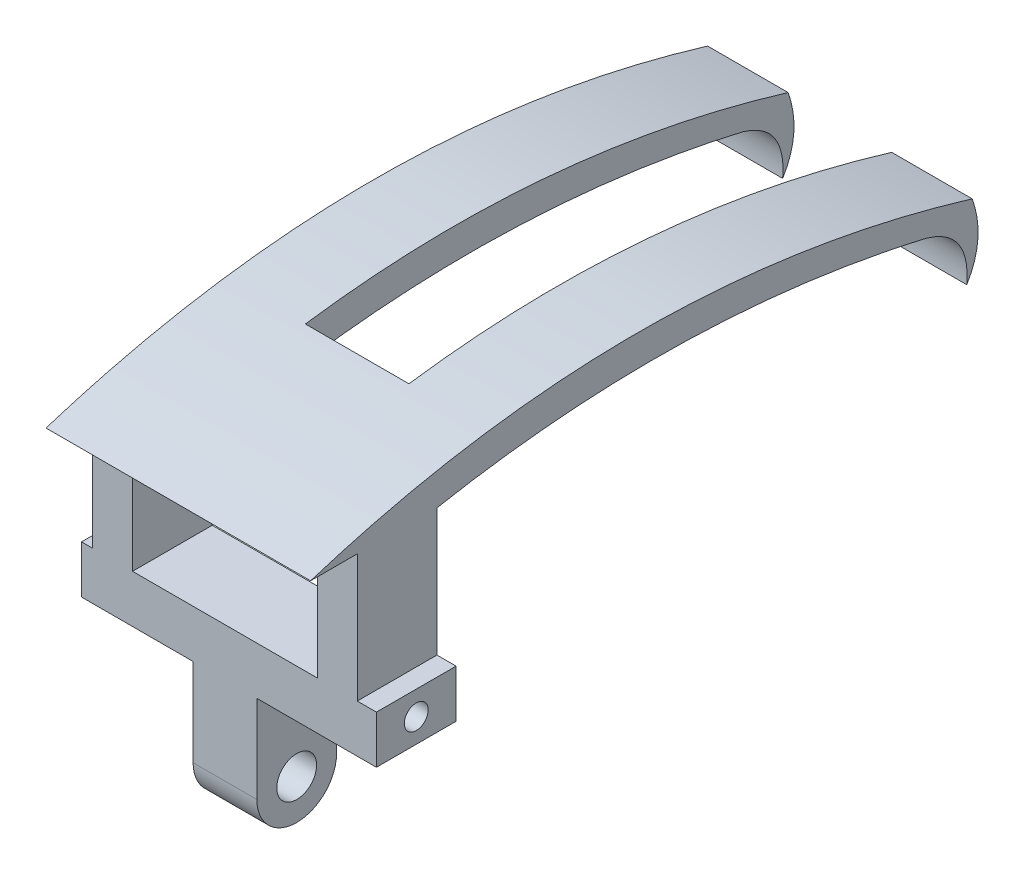
ISO-10303-21;
HEADER;
FILE_DESCRIPTION(('STEP AP214'),'2;1');
FILE_NAME('part.step','',(''),(''),'','','');
FILE_SCHEMA(('AUTOMOTIVE_DESIGN { 1 0 10303 214 1 1 1 1 }'));
ENDSEC;
DATA;
#1=APPLICATION_CONTEXT('core data for automotive mechanical design processes');
#2=APPLICATION_PROTOCOL_DEFINITION('international standard','automotive_design',2000,#1);
#3=PRODUCT_CONTEXT('',#1,'mechanical');
#4=PRODUCT('Part','Part','',(#3));
#5=PRODUCT_RELATED_PRODUCT_CATEGORY('part','',(#4));
#6=PRODUCT_DEFINITION_FORMATION('','',#4);
#7=PRODUCT_DEFINITION_CONTEXT('part definition',#1,'design');
#8=PRODUCT_DEFINITION('design','',#6,#7);
#9=PRODUCT_DEFINITION_SHAPE('','',#8);
#10=(LENGTH_UNIT() NAMED_UNIT(*) SI_UNIT(.MILLI.,.METRE.));
#11=(NAMED_UNIT(*) PLANE_ANGLE_UNIT() SI_UNIT($,.RADIAN.));
#12=(NAMED_UNIT(*) SI_UNIT($,.STERADIAN.) SOLID_ANGLE_UNIT());
#13=UNCERTAINTY_MEASURE_WITH_UNIT(LENGTH_MEASURE(1.E-05),#10,'distance_accuracy_value','');
#14=(GEOMETRIC_REPRESENTATION_CONTEXT(3) GLOBAL_UNCERTAINTY_ASSIGNED_CONTEXT((#13)) GLOBAL_UNIT_ASSIGNED_CONTEXT((#10,
#11,#12)) REPRESENTATION_CONTEXT('',''));
#15=CARTESIAN_POINT('',(0.,0.,0.));
#16=DIRECTION('',(0.,0.,1.));
#17=DIRECTION('',(1.,0.,0.));
#18=AXIS2_PLACEMENT_3D('',#15,#16,#17);
#19=CARTESIAN_POINT('',(0.,30.,0.));
#20=DIRECTION('',(0.,-1.,0.));
#21=DIRECTION('',(0.,0.,-1.));
#22=AXIS2_PLACEMENT_3D('',#19,#20,#21);
#23=PLANE('',#22);
#24=DIRECTION('',(0.,0.,1.));
#25=VECTOR('',#24,1.);
#26=CARTESIAN_POINT('',(185.,30.,0.));
#27=LINE('',#26,#25);
#28=CARTESIAN_POINT('',(185.,30.,0.));
#29=VERTEX_POINT('',#28);
#30=CARTESIAN_POINT('',(185.,30.,50.));
#31=VERTEX_POINT('',#30);
#32=EDGE_CURVE('E212',#29,#31,#27,.T.);
#33=ORIENTED_EDGE('',*,*,#32,.F.);
#34=DIRECTION('',(1.,0.,0.));
#35=VECTOR('',#34,1.);
#36=CARTESIAN_POINT('',(0.,30.,0.));
#37=LINE('',#36,#35);
#38=CARTESIAN_POINT('',(173.,30.,0.));
#39=VERTEX_POINT('',#38);
#40=EDGE_CURVE('E244',#39,#29,#37,.T.);
#41=ORIENTED_EDGE('',*,*,#40,.F.);
#42=DIRECTION('',(0.,0.,-1.));
#43=VECTOR('',#42,1.);
#44=CARTESIAN_POINT('',(173.,30.,50.));
#45=LINE('',#44,#43);
#46=CARTESIAN_POINT('',(173.,30.,50.));
#47=VERTEX_POINT('',#46);
#48=EDGE_CURVE('E233',#47,#39,#45,.T.);
#49=ORIENTED_EDGE('',*,*,#48,.F.);
#50=DIRECTION('',(1.,0.,0.));
#51=VECTOR('',#50,1.);
#52=CARTESIAN_POINT('',(0.,30.,50.));
#53=LINE('',#52,#51);
#54=EDGE_CURVE('E228',#47,#31,#53,.T.);
#55=ORIENTED_EDGE('',*,*,#54,.T.);
#56=EDGE_LOOP('',(#33,#41,#49,#55));
#57=FACE_BOUND('',#56,.T.);
#58=ADVANCED_FACE('F39',(#57),#23,.F.);
#59=CARTESIAN_POINT('',(0.,0.,0.));
#60=DIRECTION('',(0.,-1.,0.));
#61=DIRECTION('',(0.,0.,-1.));
#62=AXIS2_PLACEMENT_3D('',#59,#60,#61);
#63=PLANE('',#62);
#64=DIRECTION('',(1.,0.,0.));
#65=VECTOR('',#64,1.);
#66=CARTESIAN_POINT('',(0.,0.,0.));
#67=LINE('',#66,#65);
#68=CARTESIAN_POINT('',(110.,0.,0.));
#69=VERTEX_POINT('',#68);
#70=CARTESIAN_POINT('',(185.,0.,0.));
#71=VERTEX_POINT('',#70);
#72=EDGE_CURVE('E268',#69,#71,#67,.T.);
#73=ORIENTED_EDGE('',*,*,#72,.T.);
#74=DIRECTION('',(0.,0.,-1.));
#75=VECTOR('',#74,1.);
#76=CARTESIAN_POINT('',(185.,0.,50.));
#77=LINE('',#76,#75);
#78=CARTESIAN_POINT('',(185.,0.,50.));
#79=VERTEX_POINT('',#78);
#80=EDGE_CURVE('E56',#79,#71,#77,.T.);
#81=ORIENTED_EDGE('',*,*,#80,.F.);
#82=DIRECTION('',(1.,0.,0.));
#83=VECTOR('',#82,1.);
#84=CARTESIAN_POINT('',(0.,0.,50.));
#85=LINE('',#84,#83);
#86=CARTESIAN_POINT('',(110.,0.,50.));
#87=VERTEX_POINT('',#86);
#88=EDGE_CURVE('E230',#87,#79,#85,.T.);
#89=ORIENTED_EDGE('',*,*,#88,.F.);
#90=DIRECTION('',(0.,0.,1.));
#91=VECTOR('',#90,1.);
#92=CARTESIAN_POINT('',(110.,0.,0.));
#93=LINE('',#92,#91);
#94=EDGE_CURVE('E289',#69,#87,#93,.T.);
#95=ORIENTED_EDGE('',*,*,#94,.F.);
#96=EDGE_LOOP('',(#73,#81,#89,#95));
#97=FACE_BOUND('',#96,.T.);
#98=ADVANCED_FACE('F561',(#97),#63,.T.);
#99=CARTESIAN_POINT('',(0.,30.,50.));
#100=DIRECTION('',(0.,0.,-1.));
#101=DIRECTION('',(-1.,0.,0.));
#102=AXIS2_PLACEMENT_3D('',#99,#100,#101);
#103=PLANE('',#102);
#104=DIRECTION('',(0.,-1.,0.));
#105=VECTOR('',#104,1.);
#106=CARTESIAN_POINT('',(185.,30.,50.));
#107=LINE('',#106,#105);
#108=EDGE_CURVE('E215',#31,#79,#107,.T.);
#109=ORIENTED_EDGE('',*,*,#108,.F.);
#110=ORIENTED_EDGE('',*,*,#54,.F.);
#111=DIRECTION('',(0.,-1.,0.));
#112=VECTOR('',#111,1.);
#113=CARTESIAN_POINT('',(173.,110.,50.));
#114=LINE('',#113,#112);
#115=CARTESIAN_POINT('',(173.,110.,50.));
#116=VERTEX_POINT('',#115);
#117=EDGE_CURVE('E504',#116,#47,#114,.T.);
#118=ORIENTED_EDGE('',*,*,#117,.F.);
#119=DIRECTION('',(1.,0.,0.));
#120=VECTOR('',#119,1.);
#121=CARTESIAN_POINT('',(148.,110.,50.));
#122=LINE('',#121,#120);
#123=CARTESIAN_POINT('',(148.,110.,50.));
#124=VERTEX_POINT('',#123);
#125=EDGE_CURVE('E517',#124,#116,#122,.T.);
#126=ORIENTED_EDGE('',*,*,#125,.F.);
#127=DIRECTION('',(0.,-1.,0.));
#128=VECTOR('',#127,1.);
#129=CARTESIAN_POINT('',(148.,110.,50.));
#130=LINE('',#129,#128);
#131=CARTESIAN_POINT('',(148.,30.,50.));
#132=VERTEX_POINT('',#131);
#133=EDGE_CURVE('E506',#124,#132,#130,.T.);
#134=ORIENTED_EDGE('',*,*,#133,.T.);
#135=CARTESIAN_POINT('',(32.,30.,50.));
#136=VERTEX_POINT('',#135);
#137=EDGE_CURVE('E234',#136,#132,#53,.T.);
#138=ORIENTED_EDGE('',*,*,#137,.F.);
#139=DIRECTION('',(0.,-1.,0.));
#140=VECTOR('',#139,1.);
#141=CARTESIAN_POINT('',(32.,110.,50.));
#142=LINE('',#141,#140);
#143=CARTESIAN_POINT('',(32.,110.,50.));
#144=VERTEX_POINT('',#143);
#145=EDGE_CURVE('E538',#144,#136,#142,.T.);
#146=ORIENTED_EDGE('',*,*,#145,.F.);
#147=DIRECTION('',(1.,0.,0.));
#148=VECTOR('',#147,1.);
#149=CARTESIAN_POINT('',(7.00000000000001,110.,50.));
#150=LINE('',#149,#148);
#151=CARTESIAN_POINT('',(7.00000000000001,110.,50.));
#152=VERTEX_POINT('',#151);
#153=EDGE_CURVE('E528',#152,#144,#150,.T.);
#154=ORIENTED_EDGE('',*,*,#153,.F.);
#155=DIRECTION('',(0.,-1.,0.));
#156=VECTOR('',#155,1.);
#157=CARTESIAN_POINT('',(7.00000000000001,110.,50.));
#158=LINE('',#157,#156);
#159=CARTESIAN_POINT('',(7.00000000000001,30.,50.));
#160=VERTEX_POINT('',#159);
#161=EDGE_CURVE('E536',#152,#160,#158,.T.);
#162=ORIENTED_EDGE('',*,*,#161,.T.);
#163=CARTESIAN_POINT('',(0.,30.,50.));
#164=VERTEX_POINT('',#163);
#165=EDGE_CURVE('E237',#164,#160,#53,.T.);
#166=ORIENTED_EDGE('',*,*,#165,.F.);
#167=DIRECTION('',(0.,-1.,0.));
#168=VECTOR('',#167,1.);
#169=CARTESIAN_POINT('',(0.,30.,50.));
#170=LINE('',#169,#168);
#171=CARTESIAN_POINT('',(0.,0.,50.));
#172=VERTEX_POINT('',#171);
#173=EDGE_CURVE('E258',#164,#172,#170,.T.);
#174=ORIENTED_EDGE('',*,*,#173,.T.);
#175=CARTESIAN_POINT('',(70.,0.,50.));
#176=VERTEX_POINT('',#175);
#177=EDGE_CURVE('E265',#172,#176,#85,.T.);
#178=ORIENTED_EDGE('',*,*,#177,.T.);
#179=DIRECTION('',(0.,1.,0.));
#180=VECTOR('',#179,1.);
#181=CARTESIAN_POINT('',(70.,-80.,50.));
#182=LINE('',#181,#180);
#183=CARTESIAN_POINT('',(70.,-55.,50.));
#184=VERTEX_POINT('',#183);
#185=EDGE_CURVE('E552',#184,#176,#182,.T.);
#186=ORIENTED_EDGE('',*,*,#185,.F.);
#187=DIRECTION('',(-1.,0.,0.));
#188=VECTOR('',#187,1.);
#189=CARTESIAN_POINT('',(0.,-55.,50.));
#190=LINE('',#189,#188);
#191=CARTESIAN_POINT('',(110.,-55.,50.));
#192=VERTEX_POINT('',#191);
#193=EDGE_CURVE('E276',#184,#192,#190,.F.);
#194=ORIENTED_EDGE('',*,*,#193,.T.);
#195=DIRECTION('',(0.,1.,0.));
#196=VECTOR('',#195,1.);
#197=CARTESIAN_POINT('',(110.,-80.,50.));
#198=LINE('',#197,#196);
#199=EDGE_CURVE('E553',#192,#87,#198,.T.);
#200=ORIENTED_EDGE('',*,*,#199,.T.);
#201=ORIENTED_EDGE('',*,*,#88,.T.);
#202=EDGE_LOOP('',(#109,#110,#118,#126,#134,#138,#146,#154,#162,#166,#174,#178,#186,#194,#200,#201));
#203=FACE_BOUND('',#202,.T.);
#204=ADVANCED_FACE('F226',(#203),#103,.F.);
#205=CARTESIAN_POINT('',(0.,30.,0.));
#206=DIRECTION('',(0.,0.,-1.));
#207=DIRECTION('',(-1.,0.,0.));
#208=AXIS2_PLACEMENT_3D('',#205,#206,#207);
#209=PLANE('',#208);
#210=ORIENTED_EDGE('',*,*,#40,.T.);
#211=DIRECTION('',(0.,1.,0.));
#212=VECTOR('',#211,1.);
#213=CARTESIAN_POINT('',(185.,0.,0.));
#214=LINE('',#213,#212);
#215=EDGE_CURVE('E216',#71,#29,#214,.T.);
#216=ORIENTED_EDGE('',*,*,#215,.F.);
#217=ORIENTED_EDGE('',*,*,#72,.F.);
#218=DIRECTION('',(0.,1.,0.));
#219=VECTOR('',#218,1.);
#220=CARTESIAN_POINT('',(110.,-80.,0.));
#221=LINE('',#220,#219);
#222=CARTESIAN_POINT('',(110.,-55.,0.));
#223=VERTEX_POINT('',#222);
#224=EDGE_CURVE('E548',#223,#69,#221,.T.);
#225=ORIENTED_EDGE('',*,*,#224,.F.);
#226=DIRECTION('',(1.,0.,0.));
#227=VECTOR('',#226,1.);
#228=CARTESIAN_POINT('',(70.,-55.,0.));
#229=LINE('',#228,#227);
#230=CARTESIAN_POINT('',(70.,-55.,0.));
#231=VERTEX_POINT('',#230);
#232=EDGE_CURVE('E283',#223,#231,#229,.F.);
#233=ORIENTED_EDGE('',*,*,#232,.T.);
#234=DIRECTION('',(0.,1.,0.));
#235=VECTOR('',#234,1.);
#236=CARTESIAN_POINT('',(70.,-80.,0.));
#237=LINE('',#236,#235);
#238=CARTESIAN_POINT('',(70.,0.,0.));
#239=VERTEX_POINT('',#238);
#240=EDGE_CURVE('E550',#231,#239,#237,.T.);
#241=ORIENTED_EDGE('',*,*,#240,.T.);
#242=CARTESIAN_POINT('',(0.,0.,0.));
#243=VERTEX_POINT('',#242);
#244=EDGE_CURVE('E239',#243,#239,#67,.T.);
#245=ORIENTED_EDGE('',*,*,#244,.F.);
#246=DIRECTION('',(0.,-1.,0.));
#247=VECTOR('',#246,1.);
#248=CARTESIAN_POINT('',(0.,30.,0.));
#249=LINE('',#248,#247);
#250=CARTESIAN_POINT('',(0.,30.,0.));
#251=VERTEX_POINT('',#250);
#252=EDGE_CURVE('E262',#251,#243,#249,.T.);
#253=ORIENTED_EDGE('',*,*,#252,.F.);
#254=CARTESIAN_POINT('',(7.00000000000001,30.,0.));
#255=VERTEX_POINT('',#254);
#256=EDGE_CURVE('E249',#251,#255,#37,.T.);
#257=ORIENTED_EDGE('',*,*,#256,.T.);
#258=DIRECTION('',(0.,-1.,0.));
#259=VECTOR('',#258,1.);
#260=CARTESIAN_POINT('',(7.00000000000001,110.,0.));
#261=LINE('',#260,#259);
#262=CARTESIAN_POINT('',(7.00000000000001,110.,0.));
#263=VERTEX_POINT('',#262);
#264=EDGE_CURVE('E534',#263,#255,#261,.T.);
#265=ORIENTED_EDGE('',*,*,#264,.F.);
#266=DIRECTION('',(1.,0.,0.));
#267=VECTOR('',#266,1.);
#268=CARTESIAN_POINT('',(7.00000000000001,110.,0.));
#269=LINE('',#268,#267);
#270=CARTESIAN_POINT('',(32.,110.,0.));
#271=VERTEX_POINT('',#270);
#272=EDGE_CURVE('E521',#263,#271,#269,.T.);
#273=ORIENTED_EDGE('',*,*,#272,.T.);
#274=DIRECTION('',(0.,-1.,0.));
#275=VECTOR('',#274,1.);
#276=CARTESIAN_POINT('',(32.,110.,0.));
#277=LINE('',#276,#275);
#278=CARTESIAN_POINT('',(32.,30.,0.));
#279=VERTEX_POINT('',#278);
#280=EDGE_CURVE('E530',#271,#279,#277,.T.);
#281=ORIENTED_EDGE('',*,*,#280,.T.);
#282=CARTESIAN_POINT('',(148.,30.,0.));
#283=VERTEX_POINT('',#282);
#284=EDGE_CURVE('E248',#279,#283,#37,.T.);
#285=ORIENTED_EDGE('',*,*,#284,.T.);
#286=DIRECTION('',(0.,-1.,0.));
#287=VECTOR('',#286,1.);
#288=CARTESIAN_POINT('',(148.,110.,0.));
#289=LINE('',#288,#287);
#290=CARTESIAN_POINT('',(148.,110.,0.));
#291=VERTEX_POINT('',#290);
#292=EDGE_CURVE('E452',#291,#283,#289,.T.);
#293=ORIENTED_EDGE('',*,*,#292,.F.);
#294=DIRECTION('',(1.,0.,0.));
#295=VECTOR('',#294,1.);
#296=CARTESIAN_POINT('',(148.,110.,0.));
#297=LINE('',#296,#295);
#298=CARTESIAN_POINT('',(173.,110.,0.));
#299=VERTEX_POINT('',#298);
#300=EDGE_CURVE('E512',#291,#299,#297,.T.);
#301=ORIENTED_EDGE('',*,*,#300,.T.);
#302=DIRECTION('',(0.,-1.,0.));
#303=VECTOR('',#302,1.);
#304=CARTESIAN_POINT('',(173.,110.,0.));
#305=LINE('',#304,#303);
#306=EDGE_CURVE('E498',#299,#39,#305,.T.);
#307=ORIENTED_EDGE('',*,*,#306,.T.);
#308=EDGE_LOOP('',(#210,#216,#217,#225,#233,#241,#245,#253,#257,#265,#273,#281,#285,#293,#301,#307));
#309=FACE_BOUND('',#308,.T.);
#310=ADVANCED_FACE('F567',(#309),#209,.T.);
#311=CARTESIAN_POINT('',(-419.562765319842,102.884741789651,-307.328252939445));
#312=CARTESIAN_POINT('',(-419.562765319842,94.7930743984296,-334.882025134143));
#313=CARTESIAN_POINT('',(-419.562765319842,65.0245746761726,-332.386652105914));
#314=B_SPLINE_CURVE_WITH_KNOTS('',2,(#311,#312,#313),.UNSPECIFIED.,.F.,.F.,(3,3),(0.,1.),.UNSPECIFIED.);
#315=DIRECTION('',(1.,0.,0.));
#316=VECTOR('',#315,1.);
#317=SURFACE_OF_LINEAR_EXTRUSION('',#314,#316);
#318=DIRECTION('',(1.,0.,0.));
#319=VECTOR('',#318,1.);
#320=CARTESIAN_POINT('',(-419.562765319842,65.0245746761726,-332.386652105914));
#321=LINE('',#320,#319);
#322=CARTESIAN_POINT('',(6.99999999999978,65.0245746761726,-332.386652105914));
#323=VERTEX_POINT('',#322);
#324=CARTESIAN_POINT('',(57.4999999999998,65.0245746761726,-332.386652105914));
#325=VERTEX_POINT('',#324);
#326=EDGE_CURVE('E439',#323,#325,#321,.T.);
#327=ORIENTED_EDGE('',*,*,#326,.T.);
#328=CARTESIAN_POINT('',(57.4999999999998,102.884741789651,-307.328252939445));
#329=CARTESIAN_POINT('',(57.4999999999998,94.7930743984296,-334.882025134143));
#330=CARTESIAN_POINT('',(57.4999999999998,65.0245746761726,-332.386652105914));
#331=B_SPLINE_CURVE_WITH_KNOTS('',2,(#328,#329,#330),.UNSPECIFIED.,.F.,.F.,(3,3),(0.,1.),.UNSPECIFIED.);
#332=CARTESIAN_POINT('',(57.4999999999998,102.884741789651,-307.328252939445));
#333=VERTEX_POINT('',#332);
#334=EDGE_CURVE('E346',#325,#333,#331,.F.);
#335=ORIENTED_EDGE('',*,*,#334,.T.);
#336=DIRECTION('',(1.,0.,0.));
#337=VECTOR('',#336,1.);
#338=CARTESIAN_POINT('',(-419.562765319842,102.884741789651,-307.328252939445));
#339=LINE('',#338,#337);
#340=CARTESIAN_POINT('',(6.9999999999999,102.884741789651,-307.328252939445));
#341=VERTEX_POINT('',#340);
#342=EDGE_CURVE('E450',#341,#333,#339,.T.);
#343=ORIENTED_EDGE('',*,*,#342,.F.);
#344=CARTESIAN_POINT('',(6.9999999999999,102.884741789651,-307.328252939445));
#345=CARTESIAN_POINT('',(6.9999999999999,94.7930743984296,-334.882025134143));
#346=CARTESIAN_POINT('',(6.9999999999999,65.0245746761726,-332.386652105914));
#347=B_SPLINE_CURVE_WITH_KNOTS('',2,(#344,#345,#346),.UNSPECIFIED.,.F.,.F.,(3,3),(0.,1.),.UNSPECIFIED.);
#348=EDGE_CURVE('E371',#341,#323,#347,.T.);
#349=ORIENTED_EDGE('',*,*,#348,.T.);
#350=EDGE_LOOP('',(#327,#335,#343,#349));
#351=FACE_BOUND('',#350,.T.);
#352=ADVANCED_FACE('F485',(#351),#317,.T.);
#353=CARTESIAN_POINT('',(122.5,102.884741789651,-307.328252939445));
#354=VERTEX_POINT('',#353);
#355=CARTESIAN_POINT('',(173.,102.884741789651,-307.328252939445));
#356=VERTEX_POINT('',#355);
#357=EDGE_CURVE('E416',#354,#356,#339,.T.);
#358=ORIENTED_EDGE('',*,*,#357,.F.);
#359=CARTESIAN_POINT('',(122.5,102.884741789651,-307.328252939445));
#360=CARTESIAN_POINT('',(122.5,94.7930743984296,-334.882025134143));
#361=CARTESIAN_POINT('',(122.5,65.0245746761726,-332.386652105914));
#362=B_SPLINE_CURVE_WITH_KNOTS('',2,(#359,#360,#361),.UNSPECIFIED.,.F.,.F.,(3,3),(0.,1.),.UNSPECIFIED.);
#363=CARTESIAN_POINT('',(122.5,65.0245746761726,-332.386652105914));
#364=VERTEX_POINT('',#363);
#365=EDGE_CURVE('E64',#354,#364,#362,.T.);
#366=ORIENTED_EDGE('',*,*,#365,.T.);
#367=CARTESIAN_POINT('',(173.,65.0245746761726,-332.386652105914));
#368=VERTEX_POINT('',#367);
#369=EDGE_CURVE('E407',#364,#368,#321,.T.);
#370=ORIENTED_EDGE('',*,*,#369,.T.);
#371=CARTESIAN_POINT('',(173.,102.884741789651,-307.328252939445));
#372=CARTESIAN_POINT('',(173.,94.7930743984296,-334.882025134143));
#373=CARTESIAN_POINT('',(173.,65.0245746761726,-332.386652105914));
#374=B_SPLINE_CURVE_WITH_KNOTS('',2,(#371,#372,#373),.UNSPECIFIED.,.F.,.F.,(3,3),(0.,1.),.UNSPECIFIED.);
#375=EDGE_CURVE('E385',#356,#368,#374,.T.);
#376=ORIENTED_EDGE('',*,*,#375,.F.);
#377=EDGE_LOOP('',(#358,#366,#370,#376));
#378=FACE_BOUND('',#377,.T.);
#379=ADVANCED_FACE('F483',(#378),#317,.T.);
#380=CARTESIAN_POINT('',(-419.562765319842,65.0245746761726,-332.386652105914));
#381=CARTESIAN_POINT('',(-419.562765319842,85.0088851188832,-344.655163531021));
#382=CARTESIAN_POINT('',(-419.562765319842,110.,-335.808448858543));
#383=B_SPLINE_CURVE_WITH_KNOTS('',2,(#380,#381,#382),.UNSPECIFIED.,.F.,.F.,(3,3),(0.,1.),.UNSPECIFIED.);
#384=DIRECTION('',(1.,0.,0.));
#385=VECTOR('',#384,1.);
#386=SURFACE_OF_LINEAR_EXTRUSION('',#383,#385);
#387=DIRECTION('',(1.,0.,0.));
#388=VECTOR('',#387,1.);
#389=CARTESIAN_POINT('',(-419.562765319842,110.,-335.808448858543));
#390=LINE('',#389,#388);
#391=CARTESIAN_POINT('',(6.9999999999999,110.,-335.808448858543));
#392=VERTEX_POINT('',#391);
#393=CARTESIAN_POINT('',(57.4999999999998,110.,-335.808448858543));
#394=VERTEX_POINT('',#393);
#395=EDGE_CURVE('E429',#392,#394,#390,.T.);
#396=ORIENTED_EDGE('',*,*,#395,.T.);
#397=CARTESIAN_POINT('',(57.4999999999998,65.0245746761726,-332.386652105914));
#398=CARTESIAN_POINT('',(57.4999999999998,85.0088851188832,-344.655163531021));
#399=CARTESIAN_POINT('',(57.4999999999998,110.,-335.808448858543));
#400=B_SPLINE_CURVE_WITH_KNOTS('',2,(#397,#398,#399),.UNSPECIFIED.,.F.,.F.,(3,3),(0.,1.),.UNSPECIFIED.);
#401=EDGE_CURVE('E350',#394,#325,#400,.F.);
#402=ORIENTED_EDGE('',*,*,#401,.T.);
#403=ORIENTED_EDGE('',*,*,#326,.F.);
#404=CARTESIAN_POINT('',(6.9999999999999,65.0245746761726,-332.386652105914));
#405=CARTESIAN_POINT('',(6.9999999999999,85.0088851188832,-344.655163531021));
#406=CARTESIAN_POINT('',(6.9999999999999,110.,-335.808448858543));
#407=B_SPLINE_CURVE_WITH_KNOTS('',2,(#404,#405,#406),.UNSPECIFIED.,.F.,.F.,(3,3),(0.,1.),.UNSPECIFIED.);
#408=EDGE_CURVE('E430',#323,#392,#407,.T.);
#409=ORIENTED_EDGE('',*,*,#408,.T.);
#410=EDGE_LOOP('',(#396,#402,#403,#409));
#411=FACE_BOUND('',#410,.T.);
#412=ADVANCED_FACE('F480',(#411),#386,.T.);
#413=ORIENTED_EDGE('',*,*,#369,.F.);
#414=CARTESIAN_POINT('',(122.5,65.0245746761726,-332.386652105914));
#415=CARTESIAN_POINT('',(122.5,85.0088851188832,-344.655163531021));
#416=CARTESIAN_POINT('',(122.5,110.,-335.808448858543));
#417=B_SPLINE_CURVE_WITH_KNOTS('',2,(#414,#415,#416),.UNSPECIFIED.,.F.,.F.,(3,3),(0.,1.),.UNSPECIFIED.);
#418=CARTESIAN_POINT('',(122.5,110.,-335.808448858543));
#419=VERTEX_POINT('',#418);
#420=EDGE_CURVE('E320',#364,#419,#417,.T.);
#421=ORIENTED_EDGE('',*,*,#420,.T.);
#422=CARTESIAN_POINT('',(173.,110.,-335.808448858543));
#423=VERTEX_POINT('',#422);
#424=EDGE_CURVE('E438',#419,#423,#390,.T.);
#425=ORIENTED_EDGE('',*,*,#424,.T.);
#426=CARTESIAN_POINT('',(173.,65.0245746761726,-332.386652105914));
#427=CARTESIAN_POINT('',(173.,85.0088851188832,-344.655163531021));
#428=CARTESIAN_POINT('',(173.,110.,-335.808448858543));
#429=B_SPLINE_CURVE_WITH_KNOTS('',2,(#426,#427,#428),.UNSPECIFIED.,.F.,.F.,(3,3),(0.,1.),.UNSPECIFIED.);
#430=EDGE_CURVE('E377',#368,#423,#429,.T.);
#431=ORIENTED_EDGE('',*,*,#430,.F.);
#432=EDGE_LOOP('',(#413,#421,#425,#431));
#433=FACE_BOUND('',#432,.T.);
#434=ADVANCED_FACE('F478',(#433),#386,.T.);
#435=CARTESIAN_POINT('',(-419.562765319842,110.,-335.808448858543));
#436=CARTESIAN_POINT('',(-419.562765319842,174.375095477853,-123.322725028626));
#437=CARTESIAN_POINT('',(-419.562765319842,110.,79.2937214497549));
#438=B_SPLINE_CURVE_WITH_KNOTS('',2,(#435,#436,#437),.UNSPECIFIED.,.F.,.F.,(3,3),(0.,1.),.UNSPECIFIED.);
#439=DIRECTION('',(1.,0.,0.));
#440=VECTOR('',#439,1.);
#441=SURFACE_OF_LINEAR_EXTRUSION('',#438,#440);
#442=ORIENTED_EDGE('',*,*,#424,.F.);
#443=CARTESIAN_POINT('',(122.5,110.,-335.808448858543));
#444=CARTESIAN_POINT('',(122.5,174.375095477853,-123.322725028626));
#445=CARTESIAN_POINT('',(122.5,110.,79.2937214497549));
#446=B_SPLINE_CURVE_WITH_KNOTS('',2,(#443,#444,#445),.UNSPECIFIED.,.F.,.F.,(3,3),(0.,1.),.UNSPECIFIED.);
#447=CARTESIAN_POINT('',(122.5,135.674825220297,-32.9289495603465));
#448=VERTEX_POINT('',#447);
#449=EDGE_CURVE('E334',#419,#448,#446,.T.);
#450=ORIENTED_EDGE('',*,*,#449,.T.);
#451=DIRECTION('',(1.,0.,0.));
#452=VECTOR('',#451,1.);
#453=CARTESIAN_POINT('',(89.9999999999997,135.674825220297,-32.9289495603465));
#454=LINE('',#453,#452);
#455=CARTESIAN_POINT('',(57.5,135.674825220297,-32.9289495603465));
#456=VERTEX_POINT('',#455);
#457=EDGE_CURVE('E341',#448,#456,#454,.F.);
#458=ORIENTED_EDGE('',*,*,#457,.T.);
#459=CARTESIAN_POINT('',(57.4999999999998,110.,-335.808448858543));
#460=CARTESIAN_POINT('',(57.4999999999998,174.375095477853,-123.322725028626));
#461=CARTESIAN_POINT('',(57.4999999999998,110.,79.2937214497549));
#462=B_SPLINE_CURVE_WITH_KNOTS('',2,(#459,#460,#461),.UNSPECIFIED.,.F.,.F.,(3,3),(0.,1.),.UNSPECIFIED.);
#463=EDGE_CURVE('E318',#456,#394,#462,.F.);
#464=ORIENTED_EDGE('',*,*,#463,.T.);
#465=ORIENTED_EDGE('',*,*,#395,.F.);
#466=CARTESIAN_POINT('',(6.9999999999999,110.,-335.808448858543));
#467=CARTESIAN_POINT('',(6.9999999999999,174.375095477853,-123.322725028626));
#468=CARTESIAN_POINT('',(6.9999999999999,110.,79.2937214497549));
#469=B_SPLINE_CURVE_WITH_KNOTS('',2,(#466,#467,#468),.UNSPECIFIED.,.F.,.F.,(3,3),(0.,1.),.UNSPECIFIED.);
#470=CARTESIAN_POINT('',(6.9999999999999,110.,79.2937214497549));
#471=VERTEX_POINT('',#470);
#472=EDGE_CURVE('E424',#392,#471,#469,.T.);
#473=ORIENTED_EDGE('',*,*,#472,.T.);
#474=DIRECTION('',(1.,0.,0.));
#475=VECTOR('',#474,1.);
#476=CARTESIAN_POINT('',(-419.562765319842,110.,79.2937214497549));
#477=LINE('',#476,#475);
#478=CARTESIAN_POINT('',(173.,110.,79.2937214497549));
#479=VERTEX_POINT('',#478);
#480=EDGE_CURVE('E423',#471,#479,#477,.T.);
#481=ORIENTED_EDGE('',*,*,#480,.T.);
#482=CARTESIAN_POINT('',(173.,110.,-335.808448858543));
#483=CARTESIAN_POINT('',(173.,174.375095477853,-123.322725028626));
#484=CARTESIAN_POINT('',(173.,110.,79.2937214497549));
#485=B_SPLINE_CURVE_WITH_KNOTS('',2,(#482,#483,#484),.UNSPECIFIED.,.F.,.F.,(3,3),(0.,1.),.UNSPECIFIED.);
#486=EDGE_CURVE('E372',#423,#479,#485,.T.);
#487=ORIENTED_EDGE('',*,*,#486,.F.);
#488=EDGE_LOOP('',(#442,#450,#458,#464,#465,#473,#481,#487));
#489=FACE_BOUND('',#488,.T.);
#490=ADVANCED_FACE('F469',(#489),#441,.T.);
#491=CARTESIAN_POINT('',(-419.562765319842,110.,0.));
#492=CARTESIAN_POINT('',(-419.562765319842,138.708355763765,-153.571097440731));
#493=CARTESIAN_POINT('',(-419.562765319842,102.884741789651,-307.328252939445));
#494=B_SPLINE_CURVE_WITH_KNOTS('',2,(#491,#492,#493),.UNSPECIFIED.,.F.,.F.,(3,3),(0.,1.),.UNSPECIFIED.);
#495=DIRECTION('',(1.,0.,0.));
#496=VECTOR('',#495,1.);
#497=SURFACE_OF_LINEAR_EXTRUSION('',#494,#496);
#498=ORIENTED_EDGE('',*,*,#342,.T.);
#499=CARTESIAN_POINT('',(57.4999999999998,110.,0.));
#500=CARTESIAN_POINT('',(57.4999999999998,138.708355763765,-153.571097440731));
#501=CARTESIAN_POINT('',(57.4999999999998,102.884741789651,-307.328252939445));
#502=B_SPLINE_CURVE_WITH_KNOTS('',2,(#499,#500,#501),.UNSPECIFIED.,.F.,.F.,(3,3),(0.,1.),.UNSPECIFIED.);
#503=CARTESIAN_POINT('',(57.5,115.413646129151,-32.9289495603465));
#504=VERTEX_POINT('',#503);
#505=EDGE_CURVE('E11',#333,#504,#502,.F.);
#506=ORIENTED_EDGE('',*,*,#505,.T.);
#507=DIRECTION('',(1.,0.,0.));
#508=VECTOR('',#507,1.);
#509=CARTESIAN_POINT('',(89.9999999999997,115.413646129151,-32.9289495603465));
#510=LINE('',#509,#508);
#511=CARTESIAN_POINT('',(122.5,115.413646130531,-32.9289495603465));
#512=VERTEX_POINT('',#511);
#513=EDGE_CURVE('E49',#504,#512,#510,.T.);
#514=ORIENTED_EDGE('',*,*,#513,.T.);
#515=CARTESIAN_POINT('',(122.5,110.,0.));
#516=CARTESIAN_POINT('',(122.5,138.708355763765,-153.571097440731));
#517=CARTESIAN_POINT('',(122.5,102.884741789651,-307.328252939445));
#518=B_SPLINE_CURVE_WITH_KNOTS('',2,(#515,#516,#517),.UNSPECIFIED.,.F.,.F.,(3,3),(0.,1.),.UNSPECIFIED.);
#519=EDGE_CURVE('E285',#512,#354,#518,.T.);
#520=ORIENTED_EDGE('',*,*,#519,.T.);
#521=ORIENTED_EDGE('',*,*,#357,.T.);
#522=CARTESIAN_POINT('',(173.,110.,0.));
#523=CARTESIAN_POINT('',(173.,138.708355763765,-153.571097440731));
#524=CARTESIAN_POINT('',(173.,102.884741789651,-307.328252939445));
#525=B_SPLINE_CURVE_WITH_KNOTS('',2,(#522,#523,#524),.UNSPECIFIED.,.F.,.F.,(3,3),(0.,1.),.UNSPECIFIED.);
#526=EDGE_CURVE('E364',#299,#356,#525,.T.);
#527=ORIENTED_EDGE('',*,*,#526,.F.);
#528=ORIENTED_EDGE('',*,*,#300,.F.);
#529=DIRECTION('',(1.,0.,0.));
#530=VECTOR('',#529,1.);
#531=CARTESIAN_POINT('',(-419.562765319842,110.,0.));
#532=LINE('',#531,#530);
#533=EDGE_CURVE('E417',#271,#291,#532,.T.);
#534=ORIENTED_EDGE('',*,*,#533,.F.);
#535=ORIENTED_EDGE('',*,*,#272,.F.);
#536=CARTESIAN_POINT('',(6.9999999999999,110.,0.));
#537=CARTESIAN_POINT('',(6.9999999999999,138.708355763765,-153.571097440731));
#538=CARTESIAN_POINT('',(6.9999999999999,102.884741789651,-307.328252939445));
#539=B_SPLINE_CURVE_WITH_KNOTS('',2,(#536,#537,#538),.UNSPECIFIED.,.F.,.F.,(3,3),(0.,1.),.UNSPECIFIED.);
#540=EDGE_CURVE('E408',#263,#341,#539,.T.);
#541=ORIENTED_EDGE('',*,*,#540,.T.);
#542=EDGE_LOOP('',(#498,#506,#514,#520,#521,#527,#528,#534,#535,#541));
#543=FACE_BOUND('',#542,.T.);
#544=ADVANCED_FACE('F302',(#543),#497,.T.);
#545=ORIENTED_EDGE('',*,*,#137,.T.);
#546=DIRECTION('',(0.,0.,-1.));
#547=VECTOR('',#546,1.);
#548=CARTESIAN_POINT('',(148.,30.,50.));
#549=LINE('',#548,#547);
#550=EDGE_CURVE('E509',#132,#283,#549,.T.);
#551=ORIENTED_EDGE('',*,*,#550,.T.);
#552=ORIENTED_EDGE('',*,*,#284,.F.);
#553=DIRECTION('',(0.,0.,-1.));
#554=VECTOR('',#553,1.);
#555=CARTESIAN_POINT('',(32.,30.,50.));
#556=LINE('',#555,#554);
#557=EDGE_CURVE('E514',#136,#279,#556,.T.);
#558=ORIENTED_EDGE('',*,*,#557,.F.);
#559=EDGE_LOOP('',(#545,#551,#552,#558));
#560=FACE_BOUND('',#559,.T.);
#561=ADVANCED_FACE('F468',(#560),#23,.F.);
#562=CARTESIAN_POINT('',(0.,30.,0.));
#563=DIRECTION('',(1.,0.,0.));
#564=DIRECTION('',(0.,0.,-1.));
#565=AXIS2_PLACEMENT_3D('',#562,#563,#564);
#566=PLANE('',#565);
#567=CARTESIAN_POINT('',(0.,15.,25.));
#568=DIRECTION('',(1.,0.,0.));
#569=DIRECTION('',(0.,0.,-1.));
#570=AXIS2_PLACEMENT_3D('',#567,#568,#569);
#571=CIRCLE('',#570,7.5);
#572=CARTESIAN_POINT('',(0.,15.,17.5));
#573=VERTEX_POINT('',#572);
#574=EDGE_CURVE('E221',#573,#573,#571,.T.);
#575=ORIENTED_EDGE('',*,*,#574,.T.);
#576=EDGE_LOOP('',(#575));
#577=FACE_BOUND('',#576,.T.);
#578=DIRECTION('',(0.,0.,1.));
#579=VECTOR('',#578,1.);
#580=CARTESIAN_POINT('',(0.,0.,0.));
#581=LINE('',#580,#579);
#582=EDGE_CURVE('E235',#243,#172,#581,.T.);
#583=ORIENTED_EDGE('',*,*,#582,.T.);
#584=ORIENTED_EDGE('',*,*,#173,.F.);
#585=DIRECTION('',(0.,0.,1.));
#586=VECTOR('',#585,1.);
#587=CARTESIAN_POINT('',(0.,30.,0.));
#588=LINE('',#587,#586);
#589=EDGE_CURVE('E255',#251,#164,#588,.T.);
#590=ORIENTED_EDGE('',*,*,#589,.F.);
#591=ORIENTED_EDGE('',*,*,#252,.T.);
#592=EDGE_LOOP('',(#583,#584,#590,#591));
#593=FACE_BOUND('',#592,.T.);
#594=ADVANCED_FACE('F582',(#577,#593),#566,.F.);
#595=ORIENTED_EDGE('',*,*,#165,.T.);
#596=DIRECTION('',(0.,0.,-1.));
#597=VECTOR('',#596,1.);
#598=CARTESIAN_POINT('',(7.00000000000001,30.,50.));
#599=LINE('',#598,#597);
#600=EDGE_CURVE('E525',#160,#255,#599,.T.);
#601=ORIENTED_EDGE('',*,*,#600,.T.);
#602=ORIENTED_EDGE('',*,*,#256,.F.);
#603=ORIENTED_EDGE('',*,*,#589,.T.);
#604=EDGE_LOOP('',(#595,#601,#602,#603));
#605=FACE_BOUND('',#604,.T.);
#606=ADVANCED_FACE('F589',(#605),#23,.F.);
#607=DIRECTION('',(0.,0.,-1.));
#608=VECTOR('',#607,1.);
#609=CARTESIAN_POINT('',(70.,0.,0.));
#610=LINE('',#609,#608);
#611=EDGE_CURVE('E545',#176,#239,#610,.T.);
#612=ORIENTED_EDGE('',*,*,#611,.F.);
#613=ORIENTED_EDGE('',*,*,#177,.F.);
#614=ORIENTED_EDGE('',*,*,#582,.F.);
#615=ORIENTED_EDGE('',*,*,#244,.T.);
#616=EDGE_LOOP('',(#612,#613,#614,#615));
#617=FACE_BOUND('',#616,.T.);
#618=ADVANCED_FACE('F579',(#617),#63,.T.);
#619=CARTESIAN_POINT('',(110.,-80.,0.));
#620=DIRECTION('',(-1.,0.,0.));
#621=DIRECTION('',(0.,0.,1.));
#622=AXIS2_PLACEMENT_3D('',#619,#620,#621);
#623=PLANE('',#622);
#624=CARTESIAN_POINT('',(110.,-55.,25.));
#625=DIRECTION('',(1.,0.,0.));
#626=DIRECTION('',(0.,0.,-1.));
#627=AXIS2_PLACEMENT_3D('',#624,#625,#626);
#628=CIRCLE('',#627,12.5);
#629=CARTESIAN_POINT('',(110.,-55.,12.5));
#630=VERTEX_POINT('',#629);
#631=EDGE_CURVE('E293',#630,#630,#628,.T.);
#632=ORIENTED_EDGE('',*,*,#631,.F.);
#633=EDGE_LOOP('',(#632));
#634=FACE_BOUND('',#633,.T.);
#635=ORIENTED_EDGE('',*,*,#199,.F.);
#636=CARTESIAN_POINT('',(110.,-55.,25.));
#637=DIRECTION('',(-1.,0.,0.));
#638=DIRECTION('',(0.,0.,1.));
#639=AXIS2_PLACEMENT_3D('',#636,#637,#638);
#640=CIRCLE('',#639,25.);
#641=CARTESIAN_POINT('',(110.,-80.,25.));
#642=VERTEX_POINT('',#641);
#643=EDGE_CURVE('E281',#192,#642,#640,.F.);
#644=ORIENTED_EDGE('',*,*,#643,.T.);
#645=CARTESIAN_POINT('',(110.,-55.,25.));
#646=DIRECTION('',(-1.,0.,0.));
#647=DIRECTION('',(0.,0.,1.));
#648=AXIS2_PLACEMENT_3D('',#645,#646,#647);
#649=CIRCLE('',#648,25.);
#650=EDGE_CURVE('E279',#642,#223,#649,.F.);
#651=ORIENTED_EDGE('',*,*,#650,.T.);
#652=ORIENTED_EDGE('',*,*,#224,.T.);
#653=ORIENTED_EDGE('',*,*,#94,.T.);
#654=EDGE_LOOP('',(#635,#644,#651,#652,#653));
#655=FACE_BOUND('',#654,.T.);
#656=ADVANCED_FACE('F563',(#634,#655),#623,.F.);
#657=CARTESIAN_POINT('',(70.,-80.,0.));
#658=DIRECTION('',(1.,0.,0.));
#659=DIRECTION('',(0.,0.,-1.));
#660=AXIS2_PLACEMENT_3D('',#657,#658,#659);
#661=PLANE('',#660);
#662=CARTESIAN_POINT('',(70.,-55.,25.));
#663=DIRECTION('',(1.,0.,0.));
#664=DIRECTION('',(0.,0.,-1.));
#665=AXIS2_PLACEMENT_3D('',#662,#663,#664);
#666=CIRCLE('',#665,12.5);
#667=CARTESIAN_POINT('',(70.,-55.,12.5));
#668=VERTEX_POINT('',#667);
#669=EDGE_CURVE('E290',#668,#668,#666,.T.);
#670=ORIENTED_EDGE('',*,*,#669,.T.);
#671=EDGE_LOOP('',(#670));
#672=FACE_BOUND('',#671,.T.);
#673=CARTESIAN_POINT('',(70.,-55.,25.));
#674=DIRECTION('',(1.,0.,0.));
#675=DIRECTION('',(0.,0.,-1.));
#676=AXIS2_PLACEMENT_3D('',#673,#674,#675);
#677=CIRCLE('',#676,25.);
#678=CARTESIAN_POINT('',(70.,-80.,25.));
#679=VERTEX_POINT('',#678);
#680=EDGE_CURVE('E272',#231,#679,#677,.F.);
#681=ORIENTED_EDGE('',*,*,#680,.T.);
#682=CARTESIAN_POINT('',(70.,-55.,25.));
#683=DIRECTION('',(1.,0.,0.));
#684=DIRECTION('',(0.,0.,-1.));
#685=AXIS2_PLACEMENT_3D('',#682,#683,#684);
#686=CIRCLE('',#685,25.);
#687=EDGE_CURVE('E274',#679,#184,#686,.F.);
#688=ORIENTED_EDGE('',*,*,#687,.T.);
#689=ORIENTED_EDGE('',*,*,#185,.T.);
#690=ORIENTED_EDGE('',*,*,#611,.T.);
#691=ORIENTED_EDGE('',*,*,#240,.F.);
#692=EDGE_LOOP('',(#681,#688,#689,#690,#691));
#693=FACE_BOUND('',#692,.T.);
#694=ADVANCED_FACE('F574',(#672,#693),#661,.F.);
#695=CARTESIAN_POINT('',(0.,-55.,25.));
#696=DIRECTION('',(-1.,0.,0.));
#697=DIRECTION('',(0.,0.,1.));
#698=AXIS2_PLACEMENT_3D('',#695,#696,#697);
#699=CYLINDRICAL_SURFACE('',#698,25.);
#700=ORIENTED_EDGE('',*,*,#232,.F.);
#701=ORIENTED_EDGE('',*,*,#650,.F.);
#702=DIRECTION('',(1.,0.,0.));
#703=VECTOR('',#702,1.);
#704=CARTESIAN_POINT('',(110.,-80.,25.));
#705=LINE('',#704,#703);
#706=EDGE_CURVE('E286',#679,#642,#705,.T.);
#707=ORIENTED_EDGE('',*,*,#706,.F.);
#708=ORIENTED_EDGE('',*,*,#680,.F.);
#709=EDGE_LOOP('',(#700,#701,#707,#708));
#710=FACE_BOUND('',#709,.T.);
#711=ADVANCED_FACE('F41',(#710),#699,.T.);
#712=CARTESIAN_POINT('',(0.,-55.,25.));
#713=DIRECTION('',(-1.,0.,0.));
#714=DIRECTION('',(0.,0.,1.));
#715=AXIS2_PLACEMENT_3D('',#712,#713,#714);
#716=CYLINDRICAL_SURFACE('',#715,25.);
#717=ORIENTED_EDGE('',*,*,#643,.F.);
#718=ORIENTED_EDGE('',*,*,#193,.F.);
#719=ORIENTED_EDGE('',*,*,#687,.F.);
#720=ORIENTED_EDGE('',*,*,#706,.T.);
#721=EDGE_LOOP('',(#717,#718,#719,#720));
#722=FACE_BOUND('',#721,.T.);
#723=ADVANCED_FACE('F649',(#722),#716,.T.);
#724=CARTESIAN_POINT('',(0.,-55.,25.0000000000001));
#725=DIRECTION('',(1.,0.,0.));
#726=DIRECTION('',(0.,0.,-1.));
#727=AXIS2_PLACEMENT_3D('',#724,#725,#726);
#728=CYLINDRICAL_SURFACE('',#727,12.5);
#729=ORIENTED_EDGE('',*,*,#631,.T.);
#730=EDGE_LOOP('',(#729));
#731=FACE_BOUND('',#730,.T.);
#732=ORIENTED_EDGE('',*,*,#669,.F.);
#733=EDGE_LOOP('',(#732));
#734=FACE_BOUND('',#733,.T.);
#735=ADVANCED_FACE('F651',(#731,#734),#728,.F.);
#736=CARTESIAN_POINT('',(7.00000000000001,110.,50.));
#737=DIRECTION('',(-1.,0.,0.));
#738=DIRECTION('',(0.,0.,1.));
#739=AXIS2_PLACEMENT_3D('',#736,#737,#738);
#740=PLANE('',#739);
#741=ORIENTED_EDGE('',*,*,#600,.F.);
#742=ORIENTED_EDGE('',*,*,#161,.F.);
#743=DIRECTION('',(0.,0.,-1.));
#744=VECTOR('',#743,1.);
#745=CARTESIAN_POINT('',(7.00000000000001,110.,0.));
#746=LINE('',#745,#744);
#747=EDGE_CURVE('E418',#471,#152,#746,.T.);
#748=ORIENTED_EDGE('',*,*,#747,.F.);
#749=ORIENTED_EDGE('',*,*,#472,.F.);
#750=ORIENTED_EDGE('',*,*,#408,.F.);
#751=ORIENTED_EDGE('',*,*,#348,.F.);
#752=ORIENTED_EDGE('',*,*,#540,.F.);
#753=ORIENTED_EDGE('',*,*,#264,.T.);
#754=EDGE_LOOP('',(#741,#742,#748,#749,#750,#751,#752,#753));
#755=FACE_BOUND('',#754,.T.);
#756=ADVANCED_FACE('F588',(#755),#740,.T.);
#757=CARTESIAN_POINT('',(32.,110.,50.));
#758=DIRECTION('',(-1.,0.,0.));
#759=DIRECTION('',(0.,0.,1.));
#760=AXIS2_PLACEMENT_3D('',#757,#758,#759);
#761=PLANE('',#760);
#762=ORIENTED_EDGE('',*,*,#557,.T.);
#763=ORIENTED_EDGE('',*,*,#280,.F.);
#764=DIRECTION('',(0.,0.,-1.));
#765=VECTOR('',#764,1.);
#766=CARTESIAN_POINT('',(32.,110.,50.));
#767=LINE('',#766,#765);
#768=EDGE_CURVE('E524',#144,#271,#767,.T.);
#769=ORIENTED_EDGE('',*,*,#768,.F.);
#770=ORIENTED_EDGE('',*,*,#145,.T.);
#771=EDGE_LOOP('',(#762,#763,#769,#770));
#772=FACE_BOUND('',#771,.T.);
#773=ADVANCED_FACE('F620',(#772),#761,.F.);
#774=CARTESIAN_POINT('',(148.,110.,50.));
#775=DIRECTION('',(-1.,0.,0.));
#776=DIRECTION('',(0.,0.,1.));
#777=AXIS2_PLACEMENT_3D('',#774,#775,#776);
#778=PLANE('',#777);
#779=ORIENTED_EDGE('',*,*,#550,.F.);
#780=ORIENTED_EDGE('',*,*,#133,.F.);
#781=DIRECTION('',(0.,0.,-1.));
#782=VECTOR('',#781,1.);
#783=CARTESIAN_POINT('',(148.,110.,50.));
#784=LINE('',#783,#782);
#785=EDGE_CURVE('E503',#124,#291,#784,.T.);
#786=ORIENTED_EDGE('',*,*,#785,.T.);
#787=ORIENTED_EDGE('',*,*,#292,.T.);
#788=EDGE_LOOP('',(#779,#780,#786,#787));
#789=FACE_BOUND('',#788,.T.);
#790=ADVANCED_FACE('F615',(#789),#778,.T.);
#791=CARTESIAN_POINT('',(173.,110.,50.));
#792=DIRECTION('',(-1.,0.,0.));
#793=DIRECTION('',(0.,0.,1.));
#794=AXIS2_PLACEMENT_3D('',#791,#792,#793);
#795=PLANE('',#794);
#796=ORIENTED_EDGE('',*,*,#48,.T.);
#797=ORIENTED_EDGE('',*,*,#306,.F.);
#798=ORIENTED_EDGE('',*,*,#526,.T.);
#799=ORIENTED_EDGE('',*,*,#375,.T.);
#800=ORIENTED_EDGE('',*,*,#430,.T.);
#801=ORIENTED_EDGE('',*,*,#486,.T.);
#802=DIRECTION('',(0.,0.,-1.));
#803=VECTOR('',#802,1.);
#804=CARTESIAN_POINT('',(173.,110.,0.));
#805=LINE('',#804,#803);
#806=EDGE_CURVE('E365',#479,#116,#805,.T.);
#807=ORIENTED_EDGE('',*,*,#806,.T.);
#808=ORIENTED_EDGE('',*,*,#117,.T.);
#809=EDGE_LOOP('',(#796,#797,#798,#799,#800,#801,#807,#808));
#810=FACE_BOUND('',#809,.T.);
#811=ADVANCED_FACE('F474',(#810),#795,.F.);
#812=CARTESIAN_POINT('',(-419.562765319842,110.,0.));
#813=DIRECTION('',(0.,-1.,0.));
#814=DIRECTION('',(0.,0.,-1.));
#815=AXIS2_PLACEMENT_3D('',#812,#813,#814);
#816=PLANE('',#815);
#817=ORIENTED_EDGE('',*,*,#153,.T.);
#818=ORIENTED_EDGE('',*,*,#768,.T.);
#819=ORIENTED_EDGE('',*,*,#533,.T.);
#820=ORIENTED_EDGE('',*,*,#785,.F.);
#821=ORIENTED_EDGE('',*,*,#125,.T.);
#822=ORIENTED_EDGE('',*,*,#806,.F.);
#823=ORIENTED_EDGE('',*,*,#480,.F.);
#824=ORIENTED_EDGE('',*,*,#747,.T.);
#825=EDGE_LOOP('',(#817,#818,#819,#820,#821,#822,#823,#824));
#826=FACE_BOUND('',#825,.T.);
#827=ADVANCED_FACE('F471',(#826),#816,.T.);
#828=CARTESIAN_POINT('',(57.4999999999999,142.187547738927,-363.370111745394));
#829=DIRECTION('',(1.,0.,0.));
#830=DIRECTION('',(0.,0.,-1.));
#831=AXIS2_PLACEMENT_3D('',#828,#829,#830);
#832=PLANE('',#831);
#833=DIRECTION('',(0.,-1.,0.));
#834=VECTOR('',#833,1.);
#835=CARTESIAN_POINT('',(57.5,142.187547738927,-32.9289495603465));
#836=LINE('',#835,#834);
#837=EDGE_CURVE('E310',#456,#504,#836,.T.);
#838=ORIENTED_EDGE('',*,*,#837,.T.);
#839=ORIENTED_EDGE('',*,*,#505,.F.);
#840=ORIENTED_EDGE('',*,*,#334,.F.);
#841=ORIENTED_EDGE('',*,*,#401,.F.);
#842=ORIENTED_EDGE('',*,*,#463,.F.);
#843=EDGE_LOOP('',(#838,#839,#840,#841,#842));
#844=FACE_BOUND('',#843,.T.);
#845=ADVANCED_FACE('F315',(#844),#832,.T.);
#846=CARTESIAN_POINT('',(57.5,142.187547738927,-32.9289495603465));
#847=DIRECTION('',(0.,0.,-1.));
#848=DIRECTION('',(-1.,0.,0.));
#849=AXIS2_PLACEMENT_3D('',#846,#847,#848);
#850=PLANE('',#849);
#851=DIRECTION('',(0.,-1.,0.));
#852=VECTOR('',#851,1.);
#853=CARTESIAN_POINT('',(122.5,142.187547738927,-32.9289495603465));
#854=LINE('',#853,#852);
#855=EDGE_CURVE('E313',#448,#512,#854,.T.);
#856=ORIENTED_EDGE('',*,*,#855,.T.);
#857=ORIENTED_EDGE('',*,*,#513,.F.);
#858=ORIENTED_EDGE('',*,*,#837,.F.);
#859=ORIENTED_EDGE('',*,*,#457,.F.);
#860=EDGE_LOOP('',(#856,#857,#858,#859));
#861=FACE_BOUND('',#860,.T.);
#862=ADVANCED_FACE('F308',(#861),#850,.T.);
#863=CARTESIAN_POINT('',(122.5,142.187547738927,-363.370111745394));
#864=DIRECTION('',(-1.,0.,0.));
#865=DIRECTION('',(0.,0.,1.));
#866=AXIS2_PLACEMENT_3D('',#863,#864,#865);
#867=PLANE('',#866);
#868=ORIENTED_EDGE('',*,*,#449,.F.);
#869=ORIENTED_EDGE('',*,*,#420,.F.);
#870=ORIENTED_EDGE('',*,*,#365,.F.);
#871=ORIENTED_EDGE('',*,*,#519,.F.);
#872=ORIENTED_EDGE('',*,*,#855,.F.);
#873=EDGE_LOOP('',(#868,#869,#870,#871,#872));
#874=FACE_BOUND('',#873,.T.);
#875=ADVANCED_FACE('F635',(#874),#867,.T.);
#876=CARTESIAN_POINT('',(185.,0.,0.));
#877=DIRECTION('',(1.,0.,0.));
#878=DIRECTION('',(0.,0.,-1.));
#879=AXIS2_PLACEMENT_3D('',#876,#877,#878);
#880=PLANE('',#879);
#881=CARTESIAN_POINT('',(185.,15.,25.));
#882=DIRECTION('',(1.,0.,0.));
#883=DIRECTION('',(0.,0.,-1.));
#884=AXIS2_PLACEMENT_3D('',#881,#882,#883);
#885=CIRCLE('',#884,7.5);
#886=CARTESIAN_POINT('',(185.,15.,17.5));
#887=VERTEX_POINT('',#886);
#888=EDGE_CURVE('E814',#887,#887,#885,.T.);
#889=ORIENTED_EDGE('',*,*,#888,.F.);
#890=EDGE_LOOP('',(#889));
#891=FACE_BOUND('',#890,.T.);
#892=ORIENTED_EDGE('',*,*,#32,.T.);
#893=ORIENTED_EDGE('',*,*,#108,.T.);
#894=ORIENTED_EDGE('',*,*,#80,.T.);
#895=ORIENTED_EDGE('',*,*,#215,.T.);
#896=EDGE_LOOP('',(#892,#893,#894,#895));
#897=FACE_BOUND('',#896,.T.);
#898=ADVANCED_FACE('F214',(#891,#897),#880,.T.);
#899=CARTESIAN_POINT('',(0.,15.,25.));
#900=DIRECTION('',(1.,0.,0.));
#901=DIRECTION('',(0.,0.,-1.));
#902=AXIS2_PLACEMENT_3D('',#899,#900,#901);
#903=CYLINDRICAL_SURFACE('',#902,7.5);
#904=ORIENTED_EDGE('',*,*,#574,.F.);
#905=EDGE_LOOP('',(#904));
#906=FACE_BOUND('',#905,.T.);
#907=ORIENTED_EDGE('',*,*,#888,.T.);
#908=EDGE_LOOP('',(#907));
#909=FACE_BOUND('',#908,.T.);
#910=ADVANCED_FACE('F796',(#906,#909),#903,.F.);
#911=CLOSED_SHELL('',(#58,#98,#204,#310,#352,#379,#412,#434,#490,#544,#561,#594,#606,#618,#656,
#694,#711,#723,#735,#756,#773,#790,#811,#827,#845,#862,#875,#898,#910));
#912=MANIFOLD_SOLID_BREP('B2',#911);
#913=ADVANCED_BREP_SHAPE_REPRESENTATION('',(#18,#912),#14);
#914=SHAPE_DEFINITION_REPRESENTATION(#9,#913);
ENDSEC;
END-ISO-10303-21;
